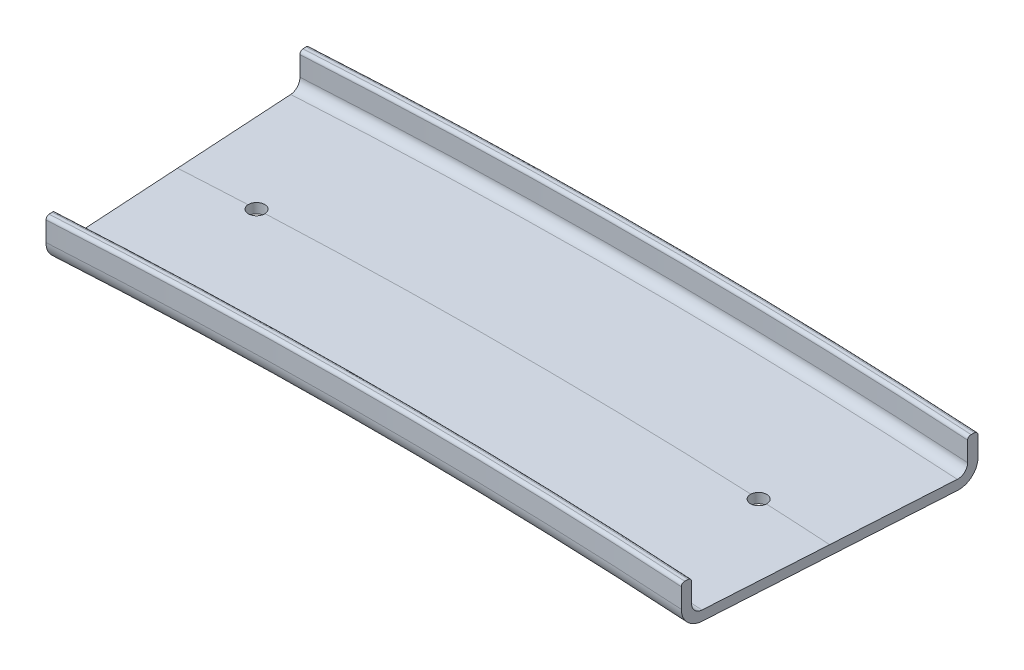
ISO-10303-21;
HEADER;
FILE_DESCRIPTION(('STEP AP214'),'2;1');
FILE_NAME('part.step','',(''),(''),'','','');
FILE_SCHEMA(('AUTOMOTIVE_DESIGN { 1 0 10303 214 1 1 1 1 }'));
ENDSEC;
DATA;
#1=APPLICATION_CONTEXT('core data for automotive mechanical design processes');
#2=APPLICATION_PROTOCOL_DEFINITION('international standard','automotive_design',2000,#1);
#3=PRODUCT_CONTEXT('',#1,'mechanical');
#4=PRODUCT('Part','Part','',(#3));
#5=PRODUCT_RELATED_PRODUCT_CATEGORY('part','',(#4));
#6=PRODUCT_DEFINITION_FORMATION('','',#4);
#7=PRODUCT_DEFINITION_CONTEXT('part definition',#1,'design');
#8=PRODUCT_DEFINITION('design','',#6,#7);
#9=PRODUCT_DEFINITION_SHAPE('','',#8);
#10=(LENGTH_UNIT() NAMED_UNIT(*) SI_UNIT(.MILLI.,.METRE.));
#11=(NAMED_UNIT(*) PLANE_ANGLE_UNIT() SI_UNIT($,.RADIAN.));
#12=(NAMED_UNIT(*) SI_UNIT($,.STERADIAN.) SOLID_ANGLE_UNIT());
#13=UNCERTAINTY_MEASURE_WITH_UNIT(LENGTH_MEASURE(1.E-05),#10,'distance_accuracy_value','');
#14=(GEOMETRIC_REPRESENTATION_CONTEXT(3) GLOBAL_UNCERTAINTY_ASSIGNED_CONTEXT((#13)) GLOBAL_UNIT_ASSIGNED_CONTEXT((#10,
#11,#12)) REPRESENTATION_CONTEXT('',''));
#15=CARTESIAN_POINT('',(0.,0.,0.));
#16=DIRECTION('',(0.,0.,1.));
#17=DIRECTION('',(1.,0.,0.));
#18=AXIS2_PLACEMENT_3D('',#15,#16,#17);
#19=CARTESIAN_POINT('',(97.7819962034165,3.,39.9334598861026));
#20=DIRECTION('',(-0.998201618543311,0.,-0.0599460485562987));
#21=DIRECTION('',(-0.0599460485562987,0.,0.998201618543311));
#22=AXIS2_PLACEMENT_3D('',#19,#20,#21);
#23=PLANE('',#22);
#24=DIRECTION('',(-0.0599460485562987,0.,0.998201618543311));
#25=VECTOR('',#24,1.);
#26=CARTESIAN_POINT('',(102.218003796583,0.,-33.9334598861024));
#27=LINE('',#26,#25);
#28=CARTESIAN_POINT('',(102.218003796583,0.,-33.9334598861025));
#29=VERTEX_POINT('',#28);
#30=CARTESIAN_POINT('',(99.9999999999995,0.,3.0000000000001));
#31=VERTEX_POINT('',#30);
#32=EDGE_CURVE('E202',#29,#31,#27,.T.);
#33=ORIENTED_EDGE('',*,*,#32,.T.);
#34=DIRECTION('',(-0.0599460485562987,0.,0.998201618543311));
#35=VECTOR('',#34,1.);
#36=CARTESIAN_POINT('',(99.9999999999995,0.,3.0000000000001));
#37=LINE('',#36,#35);
#38=CARTESIAN_POINT('',(97.7819962034165,0.,39.9334598861026));
#39=VERTEX_POINT('',#38);
#40=EDGE_CURVE('E179',#31,#39,#37,.T.);
#41=ORIENTED_EDGE('',*,*,#40,.T.);
#42=CARTESIAN_POINT('',(97.7819962034165,3.,39.9334598861026));
#43=DIRECTION('',(-0.998201618543311,0.,-0.0599460485562987));
#44=DIRECTION('',(-0.0599460485562987,0.,0.998201618543311));
#45=AXIS2_PLACEMENT_3D('',#42,#43,#44);
#46=CIRCLE('',#45,3.);
#47=CARTESIAN_POINT('',(97.6021580577476,3.,42.9280647417323));
#48=VERTEX_POINT('',#47);
#49=EDGE_CURVE('E314',#39,#48,#46,.T.);
#50=ORIENTED_EDGE('',*,*,#49,.T.);
#51=DIRECTION('',(0.,1.,0.));
#52=VECTOR('',#51,1.);
#53=CARTESIAN_POINT('',(97.6021580577476,3.00000000000002,42.9280647417325));
#54=LINE('',#53,#52);
#55=CARTESIAN_POINT('',(97.6021580577476,8.99999999999999,42.9280647417323));
#56=VERTEX_POINT('',#55);
#57=EDGE_CURVE('E308',#48,#56,#54,.T.);
#58=ORIENTED_EDGE('',*,*,#57,.T.);
#59=CARTESIAN_POINT('',(97.5422120091913,8.99999999999999,43.9262663602759));
#60=DIRECTION('',(0.998201618543311,0.,0.0599460485562987));
#61=DIRECTION('',(0.0599460485562987,0.,-0.998201618543311));
#62=AXIS2_PLACEMENT_3D('',#59,#60,#61);
#63=CIRCLE('',#62,1.);
#64=CARTESIAN_POINT('',(97.5422120091913,9.99999999999999,43.9262663602757));
#65=VERTEX_POINT('',#64);
#66=EDGE_CURVE('E300',#56,#65,#63,.T.);
#67=ORIENTED_EDGE('',*,*,#66,.T.);
#68=DIRECTION('',(-0.0599460485562987,0.,0.998201618543311));
#69=VECTOR('',#68,1.);
#70=CARTESIAN_POINT('',(97.5422120091913,10.,43.9262663602759));
#71=LINE('',#70,#69);
#72=CARTESIAN_POINT('',(97.482265960635,10.,44.9244679788192));
#73=VERTEX_POINT('',#72);
#74=EDGE_CURVE('E292',#65,#73,#71,.T.);
#75=ORIENTED_EDGE('',*,*,#74,.T.);
#76=CARTESIAN_POINT('',(97.482265960635,8.99999999999999,44.9244679788192));
#77=DIRECTION('',(0.998201618543311,0.,0.0599460485562987));
#78=DIRECTION('',(0.0599460485562987,0.,-0.998201618543311));
#79=AXIS2_PLACEMENT_3D('',#76,#77,#78);
#80=CIRCLE('',#79,1.);
#81=CARTESIAN_POINT('',(97.4223199120787,8.99999999999999,45.9226695973625));
#82=VERTEX_POINT('',#81);
#83=EDGE_CURVE('E284',#73,#82,#80,.T.);
#84=ORIENTED_EDGE('',*,*,#83,.T.);
#85=DIRECTION('',(0.,-1.,0.));
#86=VECTOR('',#85,1.);
#87=CARTESIAN_POINT('',(97.4223199120787,8.99999999999999,45.9226695973625));
#88=LINE('',#87,#86);
#89=CARTESIAN_POINT('',(97.4223199120787,2.99999999999999,45.9226695973625));
#90=VERTEX_POINT('',#89);
#91=EDGE_CURVE('E276',#82,#90,#88,.T.);
#92=ORIENTED_EDGE('',*,*,#91,.T.);
#93=CARTESIAN_POINT('',(97.7819962034165,2.99999999999999,39.9334598861026));
#94=DIRECTION('',(0.998201618543311,0.,0.0599460485562987));
#95=DIRECTION('',(0.0599460485562987,0.,-0.998201618543311));
#96=AXIS2_PLACEMENT_3D('',#93,#94,#95);
#97=CIRCLE('',#96,6.);
#98=CARTESIAN_POINT('',(97.7819962034165,-3.00000000000001,39.9334598861026));
#99=VERTEX_POINT('',#98);
#100=EDGE_CURVE('E268',#90,#99,#97,.T.);
#101=ORIENTED_EDGE('',*,*,#100,.T.);
#102=DIRECTION('',(0.0599460485562987,0.,-0.998201618543311));
#103=VECTOR('',#102,1.);
#104=CARTESIAN_POINT('',(97.7819962034165,-3.00000000000001,39.9334598861026));
#105=LINE('',#104,#103);
#106=CARTESIAN_POINT('',(102.218003796583,-3.00000000000001,-33.9334598861026));
#107=VERTEX_POINT('',#106);
#108=EDGE_CURVE('E260',#99,#107,#105,.T.);
#109=ORIENTED_EDGE('',*,*,#108,.T.);
#110=CARTESIAN_POINT('',(102.218003796583,2.99999999999999,-33.9334598861024));
#111=DIRECTION('',(0.998201618543311,0.,0.0599460485562987));
#112=DIRECTION('',(0.0599460485562987,0.,-0.998201618543311));
#113=AXIS2_PLACEMENT_3D('',#110,#111,#112);
#114=CIRCLE('',#113,6.);
#115=CARTESIAN_POINT('',(102.57768008792,2.99999999999999,-39.9226695973625));
#116=VERTEX_POINT('',#115);
#117=EDGE_CURVE('E252',#107,#116,#114,.T.);
#118=ORIENTED_EDGE('',*,*,#117,.T.);
#119=DIRECTION('',(0.,1.,0.));
#120=VECTOR('',#119,1.);
#121=CARTESIAN_POINT('',(102.57768008792,2.99999999999999,-39.9226695973623));
#122=LINE('',#121,#120);
#123=CARTESIAN_POINT('',(102.57768008792,9.00000000000001,-39.9226695973625));
#124=VERTEX_POINT('',#123);
#125=EDGE_CURVE('E244',#116,#124,#122,.T.);
#126=ORIENTED_EDGE('',*,*,#125,.T.);
#127=CARTESIAN_POINT('',(102.517734039364,9.00000000000001,-38.924467978819));
#128=DIRECTION('',(0.998201618543311,0.,0.0599460485562987));
#129=DIRECTION('',(0.0599460485562987,0.,-0.998201618543311));
#130=AXIS2_PLACEMENT_3D('',#127,#128,#129);
#131=CIRCLE('',#130,1.);
#132=CARTESIAN_POINT('',(102.517734039364,10.,-38.924467978819));
#133=VERTEX_POINT('',#132);
#134=EDGE_CURVE('E231',#124,#133,#131,.T.);
#135=ORIENTED_EDGE('',*,*,#134,.T.);
#136=DIRECTION('',(-0.0599460485562987,0.,0.998201618543311));
#137=VECTOR('',#136,1.);
#138=CARTESIAN_POINT('',(102.517734039364,10.,-38.924467978819));
#139=LINE('',#138,#137);
#140=CARTESIAN_POINT('',(102.457787990808,10.,-37.9262663602757));
#141=VERTEX_POINT('',#140);
#142=EDGE_CURVE('E229',#133,#141,#139,.T.);
#143=ORIENTED_EDGE('',*,*,#142,.T.);
#144=CARTESIAN_POINT('',(102.457787990808,9.00000000000001,-37.9262663602757));
#145=DIRECTION('',(0.998201618543311,0.,0.0599460485562987));
#146=DIRECTION('',(0.0599460485562987,0.,-0.998201618543311));
#147=AXIS2_PLACEMENT_3D('',#144,#145,#146);
#148=CIRCLE('',#147,1.);
#149=CARTESIAN_POINT('',(102.397841942251,9.00000000000001,-36.9280647417324));
#150=VERTEX_POINT('',#149);
#151=EDGE_CURVE('E224',#141,#150,#148,.T.);
#152=ORIENTED_EDGE('',*,*,#151,.T.);
#153=DIRECTION('',(0.,-1.,0.));
#154=VECTOR('',#153,1.);
#155=CARTESIAN_POINT('',(102.397841942251,9.00000000000001,-36.9280647417323));
#156=LINE('',#155,#154);
#157=CARTESIAN_POINT('',(102.397841942251,3.00000000000002,-36.9280647417324));
#158=VERTEX_POINT('',#157);
#159=EDGE_CURVE('E196',#150,#158,#156,.T.);
#160=ORIENTED_EDGE('',*,*,#159,.T.);
#161=CARTESIAN_POINT('',(102.218003796583,3.,-33.9334598861024));
#162=DIRECTION('',(-0.998201618543311,0.,-0.0599460485562987));
#163=DIRECTION('',(-0.0599460485562987,0.,0.998201618543311));
#164=AXIS2_PLACEMENT_3D('',#161,#162,#163);
#165=CIRCLE('',#164,3.);
#166=EDGE_CURVE('E203',#158,#29,#165,.T.);
#167=ORIENTED_EDGE('',*,*,#166,.T.);
#168=EDGE_LOOP('',(#33,#41,#50,#58,#67,#75,#84,#92,#101,#109,#118,#126,#135,#143,#152,#160,#167));
#169=FACE_BOUND('',#168,.T.);
#170=ADVANCED_FACE('F34',(#169),#23,.F.);
#171=CARTESIAN_POINT('',(-97.7819962034179,3.,39.9334598861027));
#172=DIRECTION('',(-0.998201618543311,0.,0.0599460485562995));
#173=DIRECTION('',(0.0599460485562996,0.,0.998201618543311));
#174=AXIS2_PLACEMENT_3D('',#171,#172,#173);
#175=PLANE('',#174);
#176=DIRECTION('',(0.0599460485562996,0.,0.998201618543311));
#177=VECTOR('',#176,1.);
#178=CARTESIAN_POINT('',(-102.218003796584,0.,-33.9334598861024));
#179=LINE('',#178,#177);
#180=CARTESIAN_POINT('',(-102.218003796584,0.,-33.9334598861024));
#181=VERTEX_POINT('',#180);
#182=CARTESIAN_POINT('',(-100.000000000001,0.,3.00000000000012));
#183=VERTEX_POINT('',#182);
#184=EDGE_CURVE('E204',#181,#183,#179,.T.);
#185=ORIENTED_EDGE('',*,*,#184,.F.);
#186=CARTESIAN_POINT('',(-102.218003796584,3.,-33.9334598861024));
#187=DIRECTION('',(-0.998201618543311,0.,0.0599460485562995));
#188=DIRECTION('',(0.0599460485562996,0.,0.998201618543311));
#189=AXIS2_PLACEMENT_3D('',#186,#187,#188);
#190=CIRCLE('',#189,3.);
#191=CARTESIAN_POINT('',(-102.397841942253,3.00000000000002,-36.9280647417323));
#192=VERTEX_POINT('',#191);
#193=EDGE_CURVE('E199',#192,#181,#190,.T.);
#194=ORIENTED_EDGE('',*,*,#193,.F.);
#195=DIRECTION('',(0.,-1.,0.));
#196=VECTOR('',#195,1.);
#197=CARTESIAN_POINT('',(-102.397841942253,9.00000000000001,-36.9280647417323));
#198=LINE('',#197,#196);
#199=CARTESIAN_POINT('',(-102.397841942253,9.00000000000001,-36.9280647417323));
#200=VERTEX_POINT('',#199);
#201=EDGE_CURVE('E11',#200,#192,#198,.T.);
#202=ORIENTED_EDGE('',*,*,#201,.F.);
#203=CARTESIAN_POINT('',(-102.457787990809,9.00000000000001,-37.9262663602756));
#204=DIRECTION('',(0.998201618543311,0.,-0.0599460485562995));
#205=DIRECTION('',(-0.0599460485562996,0.,-0.998201618543311));
#206=AXIS2_PLACEMENT_3D('',#203,#204,#205);
#207=CIRCLE('',#206,1.);
#208=CARTESIAN_POINT('',(-102.457787990809,10.,-37.9262663602757));
#209=VERTEX_POINT('',#208);
#210=EDGE_CURVE('E41',#209,#200,#207,.T.);
#211=ORIENTED_EDGE('',*,*,#210,.F.);
#212=DIRECTION('',(0.0599460485562996,0.,0.998201618543311));
#213=VECTOR('',#212,1.);
#214=CARTESIAN_POINT('',(-102.517734039366,10.,-38.9244679788189));
#215=LINE('',#214,#213);
#216=CARTESIAN_POINT('',(-102.517734039366,10.,-38.9244679788188));
#217=VERTEX_POINT('',#216);
#218=EDGE_CURVE('E234',#217,#209,#215,.T.);
#219=ORIENTED_EDGE('',*,*,#218,.F.);
#220=CARTESIAN_POINT('',(-102.517734039366,9.00000000000001,-38.9244679788189));
#221=DIRECTION('',(0.998201618543311,0.,-0.0599460485562995));
#222=DIRECTION('',(-0.0599460485562996,0.,-0.998201618543311));
#223=AXIS2_PLACEMENT_3D('',#220,#221,#222);
#224=CIRCLE('',#223,1.);
#225=CARTESIAN_POINT('',(-102.577680087922,9.00000000000001,-39.9226695973625));
#226=VERTEX_POINT('',#225);
#227=EDGE_CURVE('E235',#226,#217,#224,.T.);
#228=ORIENTED_EDGE('',*,*,#227,.F.);
#229=DIRECTION('',(0.,1.,0.));
#230=VECTOR('',#229,1.);
#231=CARTESIAN_POINT('',(-102.577680087922,2.99999999999999,-39.9226695973622));
#232=LINE('',#231,#230);
#233=CARTESIAN_POINT('',(-102.577680087922,2.99999999999999,-39.9226695973625));
#234=VERTEX_POINT('',#233);
#235=EDGE_CURVE('E241',#234,#226,#232,.T.);
#236=ORIENTED_EDGE('',*,*,#235,.F.);
#237=CARTESIAN_POINT('',(-102.218003796584,2.99999999999999,-33.9334598861024));
#238=DIRECTION('',(0.998201618543311,0.,-0.0599460485562995));
#239=DIRECTION('',(-0.0599460485562996,0.,-0.998201618543311));
#240=AXIS2_PLACEMENT_3D('',#237,#238,#239);
#241=CIRCLE('',#240,6.);
#242=CARTESIAN_POINT('',(-102.218003796584,-3.00000000000001,-33.9334598861026));
#243=VERTEX_POINT('',#242);
#244=EDGE_CURVE('E249',#243,#234,#241,.T.);
#245=ORIENTED_EDGE('',*,*,#244,.F.);
#246=DIRECTION('',(-0.0599460485562996,0.,-0.998201618543311));
#247=VECTOR('',#246,1.);
#248=CARTESIAN_POINT('',(-97.7819962034179,-3.00000000000001,39.9334598861027));
#249=LINE('',#248,#247);
#250=CARTESIAN_POINT('',(-97.7819962034179,-3.00000000000001,39.9334598861026));
#251=VERTEX_POINT('',#250);
#252=EDGE_CURVE('E257',#251,#243,#249,.T.);
#253=ORIENTED_EDGE('',*,*,#252,.F.);
#254=CARTESIAN_POINT('',(-97.7819962034179,2.99999999999999,39.9334598861027));
#255=DIRECTION('',(0.998201618543311,0.,-0.0599460485562995));
#256=DIRECTION('',(-0.0599460485562996,0.,-0.998201618543311));
#257=AXIS2_PLACEMENT_3D('',#254,#255,#256);
#258=CIRCLE('',#257,6.);
#259=CARTESIAN_POINT('',(-97.4223199120801,2.99999999999999,45.9226695973625));
#260=VERTEX_POINT('',#259);
#261=EDGE_CURVE('E265',#260,#251,#258,.T.);
#262=ORIENTED_EDGE('',*,*,#261,.F.);
#263=DIRECTION('',(0.,-1.,0.));
#264=VECTOR('',#263,1.);
#265=CARTESIAN_POINT('',(-97.4223199120801,8.99999999999999,45.9226695973625));
#266=LINE('',#265,#264);
#267=CARTESIAN_POINT('',(-97.4223199120801,8.99999999999999,45.9226695973625));
#268=VERTEX_POINT('',#267);
#269=EDGE_CURVE('E273',#268,#260,#266,.T.);
#270=ORIENTED_EDGE('',*,*,#269,.F.);
#271=CARTESIAN_POINT('',(-97.4822659606364,8.99999999999999,44.9244679788192));
#272=DIRECTION('',(0.998201618543311,0.,-0.0599460485562995));
#273=DIRECTION('',(-0.0599460485562996,0.,-0.998201618543311));
#274=AXIS2_PLACEMENT_3D('',#271,#272,#273);
#275=CIRCLE('',#274,1.);
#276=CARTESIAN_POINT('',(-97.4822659606364,10.,44.9244679788192));
#277=VERTEX_POINT('',#276);
#278=EDGE_CURVE('E281',#277,#268,#275,.T.);
#279=ORIENTED_EDGE('',*,*,#278,.F.);
#280=DIRECTION('',(0.0599460485562996,0.,0.998201618543311));
#281=VECTOR('',#280,1.);
#282=CARTESIAN_POINT('',(-97.5422120091927,10.,43.9262663602759));
#283=LINE('',#282,#281);
#284=CARTESIAN_POINT('',(-97.5422120091927,9.99999999999999,43.9262663602757));
#285=VERTEX_POINT('',#284);
#286=EDGE_CURVE('E289',#285,#277,#283,.T.);
#287=ORIENTED_EDGE('',*,*,#286,.F.);
#288=CARTESIAN_POINT('',(-97.5422120091927,8.99999999999999,43.9262663602759));
#289=DIRECTION('',(0.998201618543311,0.,-0.0599460485562995));
#290=DIRECTION('',(-0.0599460485562996,0.,-0.998201618543311));
#291=AXIS2_PLACEMENT_3D('',#288,#289,#290);
#292=CIRCLE('',#291,1.);
#293=CARTESIAN_POINT('',(-97.602158057749,8.99999999999999,42.9280647417324));
#294=VERTEX_POINT('',#293);
#295=EDGE_CURVE('E297',#294,#285,#292,.T.);
#296=ORIENTED_EDGE('',*,*,#295,.F.);
#297=DIRECTION('',(0.,1.,0.));
#298=VECTOR('',#297,1.);
#299=CARTESIAN_POINT('',(-97.602158057749,3.00000000000002,42.9280647417326));
#300=LINE('',#299,#298);
#301=CARTESIAN_POINT('',(-97.602158057749,3.,42.9280647417324));
#302=VERTEX_POINT('',#301);
#303=EDGE_CURVE('E305',#302,#294,#300,.T.);
#304=ORIENTED_EDGE('',*,*,#303,.F.);
#305=CARTESIAN_POINT('',(-97.7819962034179,3.,39.9334598861027));
#306=DIRECTION('',(-0.998201618543311,0.,0.0599460485562995));
#307=DIRECTION('',(0.0599460485562996,0.,0.998201618543311));
#308=AXIS2_PLACEMENT_3D('',#305,#306,#307);
#309=CIRCLE('',#308,3.);
#310=CARTESIAN_POINT('',(-97.7819962034179,0.,39.9334598861026));
#311=VERTEX_POINT('',#310);
#312=EDGE_CURVE('E208',#311,#302,#309,.T.);
#313=ORIENTED_EDGE('',*,*,#312,.F.);
#314=DIRECTION('',(0.0599460485562996,0.,0.998201618543311));
#315=VECTOR('',#314,1.);
#316=CARTESIAN_POINT('',(-100.000000000001,0.,3.00000000000013));
#317=LINE('',#316,#315);
#318=EDGE_CURVE('E205',#183,#311,#317,.T.);
#319=ORIENTED_EDGE('',*,*,#318,.F.);
#320=EDGE_LOOP('',(#185,#194,#202,#211,#219,#228,#236,#245,#253,#262,#270,#279,#287,#296,#304,
#313,#319));
#321=FACE_BOUND('',#320,.T.);
#322=ADVANCED_FACE('F372',(#321),#175,.T.);
#323=CARTESIAN_POINT('',(3.05311331771918E-13,3.,1668.16666666668));
#324=DIRECTION('',(0.,1.,0.));
#325=DIRECTION('',(0.,0.,1.));
#326=AXIS2_PLACEMENT_3D('',#323,#324,#325);
#327=TOROIDAL_SURFACE('',#326,1705.16666666668,3.);
#328=CARTESIAN_POINT('',(3.05311331771918E-13,0.,1668.16666666668));
#329=DIRECTION('',(0.,1.,0.));
#330=DIRECTION('',(0.0599460485562985,0.,-0.998201618543311));
#331=AXIS2_PLACEMENT_3D('',#328,#329,#330);
#332=CIRCLE('',#331,1705.16666666668);
#333=EDGE_CURVE('E189',#29,#181,#332,.T.);
#334=ORIENTED_EDGE('',*,*,#333,.F.);
#335=ORIENTED_EDGE('',*,*,#166,.F.);
#336=CARTESIAN_POINT('',(3.05311331771918E-13,3.00000000000002,1668.16666666668));
#337=DIRECTION('',(0.,1.,0.));
#338=DIRECTION('',(0.0599460485562985,0.,-0.998201618543311));
#339=AXIS2_PLACEMENT_3D('',#336,#337,#338);
#340=CIRCLE('',#339,1708.16666666668);
#341=EDGE_CURVE('E192',#158,#192,#340,.T.);
#342=ORIENTED_EDGE('',*,*,#341,.T.);
#343=ORIENTED_EDGE('',*,*,#193,.T.);
#344=EDGE_LOOP('',(#334,#335,#342,#343));
#345=FACE_BOUND('',#344,.T.);
#346=ADVANCED_FACE('F374',(#345),#327,.F.);
#347=CARTESIAN_POINT('',(102.218003796583,0.,-33.9334598861024));
#348=DIRECTION('',(0.,-1.,0.));
#349=DIRECTION('',(0.,0.,-1.));
#350=AXIS2_PLACEMENT_3D('',#347,#348,#349);
#351=PLANE('',#350);
#352=CARTESIAN_POINT('',(3.05311331771918E-13,0.,1668.16666666668));
#353=DIRECTION('',(0.,1.,0.));
#354=DIRECTION('',(0.0599460485562985,0.,-0.998201618543311));
#355=AXIS2_PLACEMENT_3D('',#352,#353,#354);
#356=CIRCLE('',#355,1668.16666666668);
#357=CARTESIAN_POINT('',(-79.4972481554049,0.,1.89531562161704));
#358=VERTEX_POINT('',#357);
#359=EDGE_CURVE('E183',#358,#183,#356,.T.);
#360=ORIENTED_EDGE('',*,*,#359,.F.);
#361=CARTESIAN_POINT('',(-77.,0.,1.77804819323902));
#362=DIRECTION('',(0.,-1.,0.));
#363=DIRECTION('',(0.,0.,-1.));
#364=AXIS2_PLACEMENT_3D('',#361,#362,#363);
#365=CIRCLE('',#364,2.5);
#366=CARTESIAN_POINT('',(-74.5025789060245,0.,1.66452339947942));
#367=VERTEX_POINT('',#366);
#368=EDGE_CURVE('E47',#358,#367,#365,.T.);
#369=ORIENTED_EDGE('',*,*,#368,.T.);
#370=CARTESIAN_POINT('',(74.5025789060246,0.,1.66452339947942));
#371=VERTEX_POINT('',#370);
#372=EDGE_CURVE('E173',#371,#367,#356,.T.);
#373=ORIENTED_EDGE('',*,*,#372,.F.);
#374=CARTESIAN_POINT('',(77.,0.,1.77804819323967));
#375=DIRECTION('',(0.,-1.,0.));
#376=DIRECTION('',(0.,0.,-1.));
#377=AXIS2_PLACEMENT_3D('',#374,#375,#376);
#378=CIRCLE('',#377,2.5);
#379=CARTESIAN_POINT('',(79.4972481554049,0.,1.89531562161704));
#380=VERTEX_POINT('',#379);
#381=EDGE_CURVE('E54',#371,#380,#378,.T.);
#382=ORIENTED_EDGE('',*,*,#381,.T.);
#383=EDGE_CURVE('E172',#31,#380,#356,.T.);
#384=ORIENTED_EDGE('',*,*,#383,.F.);
#385=ORIENTED_EDGE('',*,*,#32,.F.);
#386=ORIENTED_EDGE('',*,*,#333,.T.);
#387=ORIENTED_EDGE('',*,*,#184,.T.);
#388=EDGE_LOOP('',(#360,#369,#373,#382,#384,#385,#386,#387));
#389=FACE_BOUND('',#388,.T.);
#390=ADVANCED_FACE('F171',(#389),#351,.F.);
#391=CARTESIAN_POINT('',(99.9999999999995,0.,3.0000000000001));
#392=DIRECTION('',(0.,-1.,0.));
#393=DIRECTION('',(0.,0.,-1.));
#394=AXIS2_PLACEMENT_3D('',#391,#392,#393);
#395=PLANE('',#394);
#396=ORIENTED_EDGE('',*,*,#372,.T.);
#397=CARTESIAN_POINT('',(-77.,0.,1.77804819323902));
#398=DIRECTION('',(0.,-1.,0.));
#399=DIRECTION('',(0.,0.,-1.));
#400=AXIS2_PLACEMENT_3D('',#397,#398,#399);
#401=CIRCLE('',#400,2.5);
#402=EDGE_CURVE('E174',#367,#358,#401,.T.);
#403=ORIENTED_EDGE('',*,*,#402,.T.);
#404=ORIENTED_EDGE('',*,*,#359,.T.);
#405=ORIENTED_EDGE('',*,*,#318,.T.);
#406=CARTESIAN_POINT('',(3.05311331771918E-13,0.,1668.16666666668));
#407=DIRECTION('',(0.,1.,0.));
#408=DIRECTION('',(0.0599460485562985,0.,-0.998201618543311));
#409=AXIS2_PLACEMENT_3D('',#406,#407,#408);
#410=CIRCLE('',#409,1631.16666666668);
#411=EDGE_CURVE('E181',#39,#311,#410,.T.);
#412=ORIENTED_EDGE('',*,*,#411,.F.);
#413=ORIENTED_EDGE('',*,*,#40,.F.);
#414=ORIENTED_EDGE('',*,*,#383,.T.);
#415=CARTESIAN_POINT('',(77.,0.,1.77804819323967));
#416=DIRECTION('',(0.,-1.,0.));
#417=DIRECTION('',(0.,0.,-1.));
#418=AXIS2_PLACEMENT_3D('',#415,#416,#417);
#419=CIRCLE('',#418,2.5);
#420=EDGE_CURVE('E160',#380,#371,#419,.T.);
#421=ORIENTED_EDGE('',*,*,#420,.T.);
#422=EDGE_LOOP('',(#396,#403,#404,#405,#412,#413,#414,#421));
#423=FACE_BOUND('',#422,.T.);
#424=ADVANCED_FACE('F176',(#423),#395,.F.);
#425=CARTESIAN_POINT('',(3.05311331771918E-13,3.,1668.16666666668));
#426=DIRECTION('',(0.,1.,0.));
#427=DIRECTION('',(0.,0.,1.));
#428=AXIS2_PLACEMENT_3D('',#425,#426,#427);
#429=TOROIDAL_SURFACE('',#428,1631.16666666668,3.);
#430=CARTESIAN_POINT('',(3.05311331771918E-13,3.,1668.16666666668));
#431=DIRECTION('',(0.,1.,0.));
#432=DIRECTION('',(0.0599460485562985,0.,-0.998201618543311));
#433=AXIS2_PLACEMENT_3D('',#430,#431,#432);
#434=CIRCLE('',#433,1628.16666666668);
#435=EDGE_CURVE('E185',#48,#302,#434,.T.);
#436=ORIENTED_EDGE('',*,*,#435,.F.);
#437=ORIENTED_EDGE('',*,*,#49,.F.);
#438=ORIENTED_EDGE('',*,*,#411,.T.);
#439=ORIENTED_EDGE('',*,*,#312,.T.);
#440=EDGE_LOOP('',(#436,#437,#438,#439));
#441=FACE_BOUND('',#440,.T.);
#442=ADVANCED_FACE('F322',(#441),#429,.F.);
#443=CARTESIAN_POINT('',(3.05311331771918E-13,0.,1668.16666666668));
#444=DIRECTION('',(0.,1.,0.));
#445=DIRECTION('',(0.,0.,1.));
#446=AXIS2_PLACEMENT_3D('',#443,#444,#445);
#447=CYLINDRICAL_SURFACE('',#446,1628.16666666668);
#448=CARTESIAN_POINT('',(3.05311331771918E-13,8.99999999999999,1668.16666666668));
#449=DIRECTION('',(0.,1.,0.));
#450=DIRECTION('',(0.0599460485562985,0.,-0.998201618543311));
#451=AXIS2_PLACEMENT_3D('',#448,#449,#450);
#452=CIRCLE('',#451,1628.16666666668);
#453=EDGE_CURVE('E303',#56,#294,#452,.T.);
#454=ORIENTED_EDGE('',*,*,#453,.F.);
#455=ORIENTED_EDGE('',*,*,#57,.F.);
#456=ORIENTED_EDGE('',*,*,#435,.T.);
#457=ORIENTED_EDGE('',*,*,#303,.T.);
#458=EDGE_LOOP('',(#454,#455,#456,#457));
#459=FACE_BOUND('',#458,.T.);
#460=ADVANCED_FACE('F326',(#459),#447,.T.);
#461=CARTESIAN_POINT('',(3.05311331771918E-13,8.99999999999999,1668.16666666668));
#462=DIRECTION('',(0.,1.,0.));
#463=DIRECTION('',(0.,0.,1.));
#464=AXIS2_PLACEMENT_3D('',#461,#462,#463);
#465=TOROIDAL_SURFACE('',#464,1627.16666666668,1.);
#466=CARTESIAN_POINT('',(3.05311331771918E-13,9.99999999999999,1668.16666666668));
#467=DIRECTION('',(0.,1.,0.));
#468=DIRECTION('',(0.0599460485562985,0.,-0.998201618543311));
#469=AXIS2_PLACEMENT_3D('',#466,#467,#468);
#470=CIRCLE('',#469,1627.16666666668);
#471=EDGE_CURVE('E295',#65,#285,#470,.T.);
#472=ORIENTED_EDGE('',*,*,#471,.F.);
#473=ORIENTED_EDGE('',*,*,#66,.F.);
#474=ORIENTED_EDGE('',*,*,#453,.T.);
#475=ORIENTED_EDGE('',*,*,#295,.T.);
#476=EDGE_LOOP('',(#472,#473,#474,#475));
#477=FACE_BOUND('',#476,.T.);
#478=ADVANCED_FACE('F331',(#477),#465,.T.);
#479=CARTESIAN_POINT('',(97.5422120091913,10.,43.9262663602759));
#480=DIRECTION('',(0.,-1.,0.));
#481=DIRECTION('',(0.,0.,-1.));
#482=AXIS2_PLACEMENT_3D('',#479,#480,#481);
#483=PLANE('',#482);
#484=CARTESIAN_POINT('',(3.05311331771918E-13,10.,1668.16666666668));
#485=DIRECTION('',(0.,1.,0.));
#486=DIRECTION('',(0.0599460485562985,0.,-0.998201618543311));
#487=AXIS2_PLACEMENT_3D('',#484,#485,#486);
#488=CIRCLE('',#487,1626.16666666668);
#489=EDGE_CURVE('E287',#73,#277,#488,.T.);
#490=ORIENTED_EDGE('',*,*,#489,.F.);
#491=ORIENTED_EDGE('',*,*,#74,.F.);
#492=ORIENTED_EDGE('',*,*,#471,.T.);
#493=ORIENTED_EDGE('',*,*,#286,.T.);
#494=EDGE_LOOP('',(#490,#491,#492,#493));
#495=FACE_BOUND('',#494,.T.);
#496=ADVANCED_FACE('F334',(#495),#483,.F.);
#497=CARTESIAN_POINT('',(3.05311331771918E-13,8.99999999999999,1668.16666666668));
#498=DIRECTION('',(0.,1.,0.));
#499=DIRECTION('',(0.,0.,1.));
#500=AXIS2_PLACEMENT_3D('',#497,#498,#499);
#501=TOROIDAL_SURFACE('',#500,1626.16666666668,1.);
#502=CARTESIAN_POINT('',(3.05311331771918E-13,8.99999999999999,1668.16666666668));
#503=DIRECTION('',(0.,1.,0.));
#504=DIRECTION('',(0.0599460485562985,0.,-0.998201618543311));
#505=AXIS2_PLACEMENT_3D('',#502,#503,#504);
#506=CIRCLE('',#505,1625.16666666668);
#507=EDGE_CURVE('E279',#82,#268,#506,.T.);
#508=ORIENTED_EDGE('',*,*,#507,.F.);
#509=ORIENTED_EDGE('',*,*,#83,.F.);
#510=ORIENTED_EDGE('',*,*,#489,.T.);
#511=ORIENTED_EDGE('',*,*,#278,.T.);
#512=EDGE_LOOP('',(#508,#509,#510,#511));
#513=FACE_BOUND('',#512,.T.);
#514=ADVANCED_FACE('F338',(#513),#501,.T.);
#515=CARTESIAN_POINT('',(3.05311331771918E-13,0.,1668.16666666668));
#516=DIRECTION('',(0.,1.,0.));
#517=DIRECTION('',(0.,0.,1.));
#518=AXIS2_PLACEMENT_3D('',#515,#516,#517);
#519=CYLINDRICAL_SURFACE('',#518,1625.16666666668);
#520=CARTESIAN_POINT('',(3.05311331771918E-13,2.99999999999999,1668.16666666668));
#521=DIRECTION('',(0.,1.,0.));
#522=DIRECTION('',(0.0599460485562985,0.,-0.998201618543311));
#523=AXIS2_PLACEMENT_3D('',#520,#521,#522);
#524=CIRCLE('',#523,1625.16666666668);
#525=EDGE_CURVE('E271',#90,#260,#524,.T.);
#526=ORIENTED_EDGE('',*,*,#525,.F.);
#527=ORIENTED_EDGE('',*,*,#91,.F.);
#528=ORIENTED_EDGE('',*,*,#507,.T.);
#529=ORIENTED_EDGE('',*,*,#269,.T.);
#530=EDGE_LOOP('',(#526,#527,#528,#529));
#531=FACE_BOUND('',#530,.T.);
#532=ADVANCED_FACE('F343',(#531),#519,.F.);
#533=CARTESIAN_POINT('',(3.05311331771918E-13,2.99999999999999,1668.16666666668));
#534=DIRECTION('',(0.,1.,0.));
#535=DIRECTION('',(0.,0.,1.));
#536=AXIS2_PLACEMENT_3D('',#533,#534,#535);
#537=TOROIDAL_SURFACE('',#536,1631.16666666668,6.);
#538=CARTESIAN_POINT('',(3.05311331771918E-13,-3.00000000000001,1668.16666666668));
#539=DIRECTION('',(0.,1.,0.));
#540=DIRECTION('',(0.0599460485562985,0.,-0.998201618543311));
#541=AXIS2_PLACEMENT_3D('',#538,#539,#540);
#542=CIRCLE('',#541,1631.16666666668);
#543=EDGE_CURVE('E263',#99,#251,#542,.T.);
#544=ORIENTED_EDGE('',*,*,#543,.F.);
#545=ORIENTED_EDGE('',*,*,#100,.F.);
#546=ORIENTED_EDGE('',*,*,#525,.T.);
#547=ORIENTED_EDGE('',*,*,#261,.T.);
#548=EDGE_LOOP('',(#544,#545,#546,#547));
#549=FACE_BOUND('',#548,.T.);
#550=ADVANCED_FACE('F346',(#549),#537,.T.);
#551=CARTESIAN_POINT('',(97.7819962034165,-3.00000000000001,39.9334598861026));
#552=DIRECTION('',(0.,1.,0.));
#553=DIRECTION('',(0.,0.,1.));
#554=AXIS2_PLACEMENT_3D('',#551,#552,#553);
#555=PLANE('',#554);
#556=CARTESIAN_POINT('',(-77.,-3.00000000000001,1.77804819323902));
#557=DIRECTION('',(0.,1.,0.));
#558=DIRECTION('',(0.,0.,1.));
#559=AXIS2_PLACEMENT_3D('',#556,#557,#558);
#560=CIRCLE('',#559,2.5);
#561=CARTESIAN_POINT('',(-77.,-3.00000000000001,4.27804819323902));
#562=VERTEX_POINT('',#561);
#563=EDGE_CURVE('E166',#562,#562,#560,.T.);
#564=ORIENTED_EDGE('',*,*,#563,.T.);
#565=EDGE_LOOP('',(#564));
#566=FACE_BOUND('',#565,.T.);
#567=CARTESIAN_POINT('',(77.,-3.00000000000001,1.77804819323967));
#568=DIRECTION('',(0.,1.,0.));
#569=DIRECTION('',(0.,0.,1.));
#570=AXIS2_PLACEMENT_3D('',#567,#568,#569);
#571=CIRCLE('',#570,2.5);
#572=CARTESIAN_POINT('',(77.,-3.00000000000001,4.27804819323966));
#573=VERTEX_POINT('',#572);
#574=EDGE_CURVE('E378',#573,#573,#571,.T.);
#575=ORIENTED_EDGE('',*,*,#574,.T.);
#576=EDGE_LOOP('',(#575));
#577=FACE_BOUND('',#576,.T.);
#578=CARTESIAN_POINT('',(3.05311331771918E-13,-3.00000000000001,1668.16666666668));
#579=DIRECTION('',(0.,1.,0.));
#580=DIRECTION('',(0.0599460485562985,0.,-0.998201618543311));
#581=AXIS2_PLACEMENT_3D('',#578,#579,#580);
#582=CIRCLE('',#581,1705.16666666668);
#583=EDGE_CURVE('E255',#107,#243,#582,.T.);
#584=ORIENTED_EDGE('',*,*,#583,.F.);
#585=ORIENTED_EDGE('',*,*,#108,.F.);
#586=ORIENTED_EDGE('',*,*,#543,.T.);
#587=ORIENTED_EDGE('',*,*,#252,.T.);
#588=EDGE_LOOP('',(#584,#585,#586,#587));
#589=FACE_BOUND('',#588,.T.);
#590=ADVANCED_FACE('F350',(#566,#577,#589),#555,.F.);
#591=CARTESIAN_POINT('',(3.05311331771918E-13,2.99999999999999,1668.16666666668));
#592=DIRECTION('',(0.,1.,0.));
#593=DIRECTION('',(0.,0.,1.));
#594=AXIS2_PLACEMENT_3D('',#591,#592,#593);
#595=TOROIDAL_SURFACE('',#594,1705.16666666668,6.);
#596=CARTESIAN_POINT('',(3.05311331771918E-13,2.99999999999999,1668.16666666668));
#597=DIRECTION('',(0.,1.,0.));
#598=DIRECTION('',(0.0599460485562985,0.,-0.998201618543311));
#599=AXIS2_PLACEMENT_3D('',#596,#597,#598);
#600=CIRCLE('',#599,1711.16666666668);
#601=EDGE_CURVE('E247',#116,#234,#600,.T.);
#602=ORIENTED_EDGE('',*,*,#601,.F.);
#603=ORIENTED_EDGE('',*,*,#117,.F.);
#604=ORIENTED_EDGE('',*,*,#583,.T.);
#605=ORIENTED_EDGE('',*,*,#244,.T.);
#606=EDGE_LOOP('',(#602,#603,#604,#605));
#607=FACE_BOUND('',#606,.T.);
#608=ADVANCED_FACE('F355',(#607),#595,.T.);
#609=CARTESIAN_POINT('',(3.05311331771918E-13,0.,1668.16666666668));
#610=DIRECTION('',(0.,1.,0.));
#611=DIRECTION('',(0.,0.,1.));
#612=AXIS2_PLACEMENT_3D('',#609,#610,#611);
#613=CYLINDRICAL_SURFACE('',#612,1711.16666666668);
#614=CARTESIAN_POINT('',(3.05311331771918E-13,9.00000000000001,1668.16666666668));
#615=DIRECTION('',(0.,1.,0.));
#616=DIRECTION('',(0.0599460485562985,0.,-0.998201618543311));
#617=AXIS2_PLACEMENT_3D('',#614,#615,#616);
#618=CIRCLE('',#617,1711.16666666668);
#619=EDGE_CURVE('E239',#124,#226,#618,.T.);
#620=ORIENTED_EDGE('',*,*,#619,.F.);
#621=ORIENTED_EDGE('',*,*,#125,.F.);
#622=ORIENTED_EDGE('',*,*,#601,.T.);
#623=ORIENTED_EDGE('',*,*,#235,.T.);
#624=EDGE_LOOP('',(#620,#621,#622,#623));
#625=FACE_BOUND('',#624,.T.);
#626=ADVANCED_FACE('F358',(#625),#613,.T.);
#627=CARTESIAN_POINT('',(3.05311331771918E-13,9.00000000000001,1668.16666666668));
#628=DIRECTION('',(0.,1.,0.));
#629=DIRECTION('',(0.,0.,1.));
#630=AXIS2_PLACEMENT_3D('',#627,#628,#629);
#631=TOROIDAL_SURFACE('',#630,1710.16666666668,1.);
#632=CARTESIAN_POINT('',(3.05311331771918E-13,10.,1668.16666666668));
#633=DIRECTION('',(0.,1.,0.));
#634=DIRECTION('',(0.0599460485562985,0.,-0.998201618543311));
#635=AXIS2_PLACEMENT_3D('',#632,#633,#634);
#636=CIRCLE('',#635,1710.16666666668);
#637=EDGE_CURVE('E219',#133,#217,#636,.T.);
#638=ORIENTED_EDGE('',*,*,#637,.F.);
#639=ORIENTED_EDGE('',*,*,#134,.F.);
#640=ORIENTED_EDGE('',*,*,#619,.T.);
#641=ORIENTED_EDGE('',*,*,#227,.T.);
#642=EDGE_LOOP('',(#638,#639,#640,#641));
#643=FACE_BOUND('',#642,.T.);
#644=ADVANCED_FACE('F362',(#643),#631,.T.);
#645=CARTESIAN_POINT('',(102.517734039364,10.,-38.924467978819));
#646=DIRECTION('',(0.,-1.,0.));
#647=DIRECTION('',(0.,0.,-1.));
#648=AXIS2_PLACEMENT_3D('',#645,#646,#647);
#649=PLANE('',#648);
#650=CARTESIAN_POINT('',(3.05311331771918E-13,10.,1668.16666666668));
#651=DIRECTION('',(0.,1.,0.));
#652=DIRECTION('',(0.0599460485562985,0.,-0.998201618543311));
#653=AXIS2_PLACEMENT_3D('',#650,#651,#652);
#654=CIRCLE('',#653,1709.16666666668);
#655=EDGE_CURVE('E214',#141,#209,#654,.T.);
#656=ORIENTED_EDGE('',*,*,#655,.F.);
#657=ORIENTED_EDGE('',*,*,#142,.F.);
#658=ORIENTED_EDGE('',*,*,#637,.T.);
#659=ORIENTED_EDGE('',*,*,#218,.T.);
#660=EDGE_LOOP('',(#656,#657,#658,#659));
#661=FACE_BOUND('',#660,.T.);
#662=ADVANCED_FACE('F366',(#661),#649,.F.);
#663=CARTESIAN_POINT('',(3.05311331771918E-13,9.00000000000001,1668.16666666668));
#664=DIRECTION('',(0.,1.,0.));
#665=DIRECTION('',(0.,0.,1.));
#666=AXIS2_PLACEMENT_3D('',#663,#664,#665);
#667=TOROIDAL_SURFACE('',#666,1709.16666666668,1.);
#668=CARTESIAN_POINT('',(3.05311331771918E-13,9.00000000000001,1668.16666666668));
#669=DIRECTION('',(0.,1.,0.));
#670=DIRECTION('',(0.0599460485562985,0.,-0.998201618543311));
#671=AXIS2_PLACEMENT_3D('',#668,#669,#670);
#672=CIRCLE('',#671,1708.16666666668);
#673=EDGE_CURVE('E210',#150,#200,#672,.T.);
#674=ORIENTED_EDGE('',*,*,#673,.F.);
#675=ORIENTED_EDGE('',*,*,#151,.F.);
#676=ORIENTED_EDGE('',*,*,#655,.T.);
#677=ORIENTED_EDGE('',*,*,#210,.T.);
#678=EDGE_LOOP('',(#674,#675,#676,#677));
#679=FACE_BOUND('',#678,.T.);
#680=ADVANCED_FACE('F369',(#679),#667,.T.);
#681=CARTESIAN_POINT('',(3.05311331771918E-13,0.,1668.16666666668));
#682=DIRECTION('',(0.,1.,0.));
#683=DIRECTION('',(0.,0.,1.));
#684=AXIS2_PLACEMENT_3D('',#681,#682,#683);
#685=CYLINDRICAL_SURFACE('',#684,1708.16666666668);
#686=ORIENTED_EDGE('',*,*,#201,.T.);
#687=ORIENTED_EDGE('',*,*,#341,.F.);
#688=ORIENTED_EDGE('',*,*,#159,.F.);
#689=ORIENTED_EDGE('',*,*,#673,.T.);
#690=EDGE_LOOP('',(#686,#687,#688,#689));
#691=FACE_BOUND('',#690,.T.);
#692=ADVANCED_FACE('F373',(#691),#685,.F.);
#693=CARTESIAN_POINT('',(77.,-3.00000000000001,1.77804819323967));
#694=DIRECTION('',(0.,1.,0.));
#695=DIRECTION('',(0.,0.,1.));
#696=AXIS2_PLACEMENT_3D('',#693,#694,#695);
#697=CYLINDRICAL_SURFACE('',#696,2.5);
#698=ORIENTED_EDGE('',*,*,#574,.F.);
#699=EDGE_LOOP('',(#698));
#700=FACE_BOUND('',#699,.T.);
#701=ORIENTED_EDGE('',*,*,#420,.F.);
#702=ORIENTED_EDGE('',*,*,#381,.F.);
#703=EDGE_LOOP('',(#701,#702));
#704=FACE_BOUND('',#703,.T.);
#705=ADVANCED_FACE('F161',(#700,#704),#697,.F.);
#706=CARTESIAN_POINT('',(-77.,-3.00000000000001,1.77804819323902));
#707=DIRECTION('',(0.,1.,0.));
#708=DIRECTION('',(0.,0.,1.));
#709=AXIS2_PLACEMENT_3D('',#706,#707,#708);
#710=CYLINDRICAL_SURFACE('',#709,2.5);
#711=ORIENTED_EDGE('',*,*,#563,.F.);
#712=EDGE_LOOP('',(#711));
#713=FACE_BOUND('',#712,.T.);
#714=ORIENTED_EDGE('',*,*,#402,.F.);
#715=ORIENTED_EDGE('',*,*,#368,.F.);
#716=EDGE_LOOP('',(#714,#715));
#717=FACE_BOUND('',#716,.T.);
#718=ADVANCED_FACE('F386',(#713,#717),#710,.F.);
#719=CLOSED_SHELL('',(#170,#322,#346,#390,#424,#442,#460,#478,#496,#514,#532,#550,#590,#608,
#626,#644,#662,#680,#692,#705,#718));
#720=MANIFOLD_SOLID_BREP('B2',#719);
#721=ADVANCED_BREP_SHAPE_REPRESENTATION('',(#18,#720),#14);
#722=SHAPE_DEFINITION_REPRESENTATION(#9,#721);
ENDSEC;
END-ISO-10303-21;
